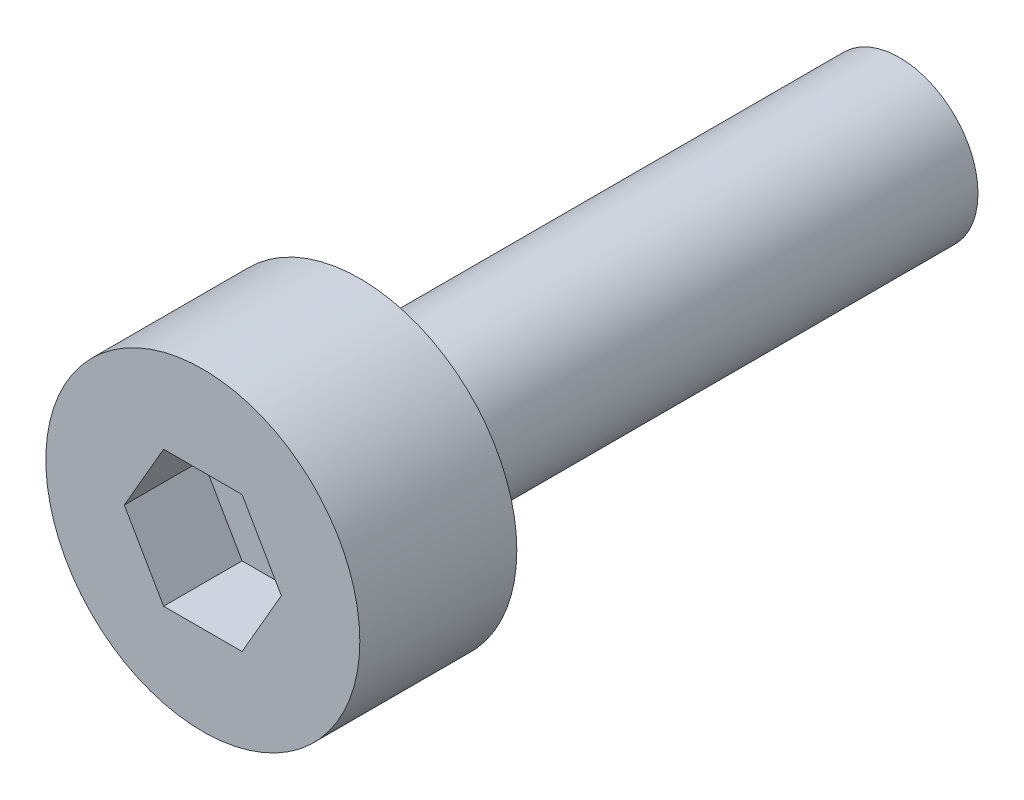
ISO-10303-21;
HEADER;
FILE_DESCRIPTION(('STEP AP214'),'2;1');
FILE_NAME('part.step','',(''),(''),'','','');
FILE_SCHEMA(('AUTOMOTIVE_DESIGN { 1 0 10303 214 1 1 1 1 }'));
ENDSEC;
DATA;
#1=APPLICATION_CONTEXT('core data for automotive mechanical design processes');
#2=APPLICATION_PROTOCOL_DEFINITION('international standard','automotive_design',2000,#1);
#3=PRODUCT_CONTEXT('',#1,'mechanical');
#4=PRODUCT('Part','Part','',(#3));
#5=PRODUCT_RELATED_PRODUCT_CATEGORY('part','',(#4));
#6=PRODUCT_DEFINITION_FORMATION('','',#4);
#7=PRODUCT_DEFINITION_CONTEXT('part definition',#1,'design');
#8=PRODUCT_DEFINITION('design','',#6,#7);
#9=PRODUCT_DEFINITION_SHAPE('','',#8);
#10=(LENGTH_UNIT() NAMED_UNIT(*) SI_UNIT(.MILLI.,.METRE.));
#11=(NAMED_UNIT(*) PLANE_ANGLE_UNIT() SI_UNIT($,.RADIAN.));
#12=(NAMED_UNIT(*) SI_UNIT($,.STERADIAN.) SOLID_ANGLE_UNIT());
#13=UNCERTAINTY_MEASURE_WITH_UNIT(LENGTH_MEASURE(1.E-05),#10,'distance_accuracy_value','');
#14=(GEOMETRIC_REPRESENTATION_CONTEXT(3) GLOBAL_UNCERTAINTY_ASSIGNED_CONTEXT((#13)) GLOBAL_UNIT_ASSIGNED_CONTEXT((#10,
#11,#12)) REPRESENTATION_CONTEXT('',''));
#15=CARTESIAN_POINT('',(0.,0.,0.));
#16=DIRECTION('',(0.,0.,1.));
#17=DIRECTION('',(1.,0.,0.));
#18=AXIS2_PLACEMENT_3D('',#15,#16,#17);
#19=CARTESIAN_POINT('',(0.,0.,1.6));
#20=DIRECTION('',(0.,0.,-1.));
#21=DIRECTION('',(-1.,0.,0.));
#22=AXIS2_PLACEMENT_3D('',#19,#20,#21);
#23=CYLINDRICAL_SURFACE('',#22,1.6);
#24=CARTESIAN_POINT('',(0.,0.,1.6));
#25=DIRECTION('',(0.,0.,1.));
#26=DIRECTION('',(1.,0.,0.));
#27=AXIS2_PLACEMENT_3D('',#24,#25,#26);
#28=CIRCLE('',#27,1.6);
#29=CARTESIAN_POINT('',(1.6,0.,1.6));
#30=VERTEX_POINT('',#29);
#31=EDGE_CURVE('E11',#30,#30,#28,.T.);
#32=ORIENTED_EDGE('',*,*,#31,.F.);
#33=EDGE_LOOP('',(#32));
#34=FACE_BOUND('',#33,.T.);
#35=CARTESIAN_POINT('',(0.,0.,0.));
#36=DIRECTION('',(0.,0.,1.));
#37=DIRECTION('',(1.,0.,0.));
#38=AXIS2_PLACEMENT_3D('',#35,#36,#37);
#39=CIRCLE('',#38,1.6);
#40=CARTESIAN_POINT('',(1.6,0.,0.));
#41=VERTEX_POINT('',#40);
#42=EDGE_CURVE('E35',#41,#41,#39,.T.);
#43=ORIENTED_EDGE('',*,*,#42,.T.);
#44=EDGE_LOOP('',(#43));
#45=FACE_BOUND('',#44,.T.);
#46=ADVANCED_FACE('F32',(#34,#45),#23,.T.);
#47=CARTESIAN_POINT('',(0.,0.,1.6));
#48=DIRECTION('',(0.,0.,1.));
#49=DIRECTION('',(1.,0.,0.));
#50=AXIS2_PLACEMENT_3D('',#47,#48,#49);
#51=PLANE('',#50);
#52=DIRECTION('',(0.5,0.866025403784439,0.));
#53=VECTOR('',#52,1.);
#54=CARTESIAN_POINT('',(0.4,-0.692820323027551,1.6));
#55=LINE('',#54,#53);
#56=CARTESIAN_POINT('',(0.4,-0.692820323027551,1.6));
#57=VERTEX_POINT('',#56);
#58=CARTESIAN_POINT('',(0.8,0.,1.6));
#59=VERTEX_POINT('',#58);
#60=EDGE_CURVE('E46',#57,#59,#55,.T.);
#61=ORIENTED_EDGE('',*,*,#60,.F.);
#62=DIRECTION('',(1.,0.,0.));
#63=VECTOR('',#62,1.);
#64=CARTESIAN_POINT('',(-0.4,-0.692820323027551,1.6));
#65=LINE('',#64,#63);
#66=CARTESIAN_POINT('',(-0.4,-0.692820323027551,1.6));
#67=VERTEX_POINT('',#66);
#68=EDGE_CURVE('E129',#67,#57,#65,.T.);
#69=ORIENTED_EDGE('',*,*,#68,.F.);
#70=DIRECTION('',(0.5,-0.866025403784438,0.));
#71=VECTOR('',#70,1.);
#72=CARTESIAN_POINT('',(-0.8,0.,1.6));
#73=LINE('',#72,#71);
#74=CARTESIAN_POINT('',(-0.8,0.,1.6));
#75=VERTEX_POINT('',#74);
#76=EDGE_CURVE('E127',#75,#67,#73,.T.);
#77=ORIENTED_EDGE('',*,*,#76,.F.);
#78=DIRECTION('',(-0.5,-0.866025403784439,0.));
#79=VECTOR('',#78,1.);
#80=CARTESIAN_POINT('',(-0.4,0.692820323027551,1.6));
#81=LINE('',#80,#79);
#82=CARTESIAN_POINT('',(-0.4,0.692820323027551,1.6));
#83=VERTEX_POINT('',#82);
#84=EDGE_CURVE('E94',#83,#75,#81,.T.);
#85=ORIENTED_EDGE('',*,*,#84,.F.);
#86=DIRECTION('',(-1.,0.,0.));
#87=VECTOR('',#86,1.);
#88=CARTESIAN_POINT('',(0.4,0.692820323027551,1.6));
#89=LINE('',#88,#87);
#90=CARTESIAN_POINT('',(0.4,0.692820323027551,1.6));
#91=VERTEX_POINT('',#90);
#92=EDGE_CURVE('E123',#91,#83,#89,.T.);
#93=ORIENTED_EDGE('',*,*,#92,.F.);
#94=DIRECTION('',(-0.5,0.866025403784438,0.));
#95=VECTOR('',#94,1.);
#96=CARTESIAN_POINT('',(0.8,0.,1.6));
#97=LINE('',#96,#95);
#98=EDGE_CURVE('E120',#59,#91,#97,.T.);
#99=ORIENTED_EDGE('',*,*,#98,.F.);
#100=EDGE_LOOP('',(#61,#69,#77,#85,#93,#99));
#101=FACE_BOUND('',#100,.T.);
#102=ORIENTED_EDGE('',*,*,#31,.T.);
#103=EDGE_LOOP('',(#102));
#104=FACE_BOUND('',#103,.T.);
#105=ADVANCED_FACE('F160',(#101,#104),#51,.T.);
#106=CARTESIAN_POINT('',(0.,0.,0.));
#107=DIRECTION('',(0.,0.,1.));
#108=DIRECTION('',(1.,0.,0.));
#109=AXIS2_PLACEMENT_3D('',#106,#107,#108);
#110=PLANE('',#109);
#111=CARTESIAN_POINT('',(0.,0.,0.));
#112=DIRECTION('',(0.,0.,1.));
#113=DIRECTION('',(1.,0.,0.));
#114=AXIS2_PLACEMENT_3D('',#111,#112,#113);
#115=CIRCLE('',#114,0.8);
#116=CARTESIAN_POINT('',(0.8,0.,0.));
#117=VERTEX_POINT('',#116);
#118=EDGE_CURVE('E133',#117,#117,#115,.T.);
#119=ORIENTED_EDGE('',*,*,#118,.T.);
#120=EDGE_LOOP('',(#119));
#121=FACE_BOUND('',#120,.T.);
#122=ORIENTED_EDGE('',*,*,#42,.F.);
#123=EDGE_LOOP('',(#122));
#124=FACE_BOUND('',#123,.T.);
#125=ADVANCED_FACE('F145',(#121,#124),#110,.F.);
#126=CARTESIAN_POINT('',(0.,0.,-5.5));
#127=DIRECTION('',(0.,0.,1.));
#128=DIRECTION('',(1.,0.,0.));
#129=AXIS2_PLACEMENT_3D('',#126,#127,#128);
#130=CYLINDRICAL_SURFACE('',#129,0.8);
#131=CARTESIAN_POINT('',(0.,0.,-5.5));
#132=DIRECTION('',(0.,0.,1.));
#133=DIRECTION('',(1.,0.,0.));
#134=AXIS2_PLACEMENT_3D('',#131,#132,#133);
#135=CIRCLE('',#134,0.8);
#136=CARTESIAN_POINT('',(0.8,0.,-5.5));
#137=VERTEX_POINT('',#136);
#138=EDGE_CURVE('E139',#137,#137,#135,.T.);
#139=ORIENTED_EDGE('',*,*,#138,.T.);
#140=EDGE_LOOP('',(#139));
#141=FACE_BOUND('',#140,.T.);
#142=ORIENTED_EDGE('',*,*,#118,.F.);
#143=EDGE_LOOP('',(#142));
#144=FACE_BOUND('',#143,.T.);
#145=ADVANCED_FACE('F148',(#141,#144),#130,.T.);
#146=CARTESIAN_POINT('',(0.,0.,-5.5));
#147=DIRECTION('',(0.,0.,1.));
#148=DIRECTION('',(1.,0.,0.));
#149=AXIS2_PLACEMENT_3D('',#146,#147,#148);
#150=PLANE('',#149);
#151=ORIENTED_EDGE('',*,*,#138,.F.);
#152=EDGE_LOOP('',(#151));
#153=FACE_BOUND('',#152,.T.);
#154=ADVANCED_FACE('F150',(#153),#150,.F.);
#155=CARTESIAN_POINT('',(0.4,-0.692820323027551,0.8));
#156=DIRECTION('',(0.866025403784439,-0.5,0.));
#157=DIRECTION('',(0.5,0.866025403784439,0.));
#158=AXIS2_PLACEMENT_3D('',#155,#156,#157);
#159=PLANE('',#158);
#160=ORIENTED_EDGE('',*,*,#60,.T.);
#161=DIRECTION('',(0.,0.,1.));
#162=VECTOR('',#161,1.);
#163=CARTESIAN_POINT('',(0.8,0.,0.8));
#164=LINE('',#163,#162);
#165=CARTESIAN_POINT('',(0.8,0.,0.8));
#166=VERTEX_POINT('',#165);
#167=EDGE_CURVE('E76',#166,#59,#164,.T.);
#168=ORIENTED_EDGE('',*,*,#167,.F.);
#169=DIRECTION('',(0.5,0.866025403784439,0.));
#170=VECTOR('',#169,1.);
#171=CARTESIAN_POINT('',(0.4,-0.692820323027551,0.8));
#172=LINE('',#171,#170);
#173=CARTESIAN_POINT('',(0.4,-0.692820323027551,0.8));
#174=VERTEX_POINT('',#173);
#175=EDGE_CURVE('E131',#174,#166,#172,.T.);
#176=ORIENTED_EDGE('',*,*,#175,.F.);
#177=DIRECTION('',(0.,0.,1.));
#178=VECTOR('',#177,1.);
#179=CARTESIAN_POINT('',(0.4,-0.692820323027551,0.8));
#180=LINE('',#179,#178);
#181=EDGE_CURVE('E54',#174,#57,#180,.T.);
#182=ORIENTED_EDGE('',*,*,#181,.T.);
#183=EDGE_LOOP('',(#160,#168,#176,#182));
#184=FACE_BOUND('',#183,.T.);
#185=ADVANCED_FACE('F157',(#184),#159,.F.);
#186=CARTESIAN_POINT('',(-0.4,-0.692820323027551,0.8));
#187=DIRECTION('',(0.,-1.,0.));
#188=DIRECTION('',(0.,0.,-1.));
#189=AXIS2_PLACEMENT_3D('',#186,#187,#188);
#190=PLANE('',#189);
#191=ORIENTED_EDGE('',*,*,#68,.T.);
#192=ORIENTED_EDGE('',*,*,#181,.F.);
#193=DIRECTION('',(1.,0.,0.));
#194=VECTOR('',#193,1.);
#195=CARTESIAN_POINT('',(-0.4,-0.692820323027551,0.8));
#196=LINE('',#195,#194);
#197=CARTESIAN_POINT('',(-0.4,-0.692820323027551,0.8));
#198=VERTEX_POINT('',#197);
#199=EDGE_CURVE('E106',#198,#174,#196,.T.);
#200=ORIENTED_EDGE('',*,*,#199,.F.);
#201=DIRECTION('',(0.,0.,1.));
#202=VECTOR('',#201,1.);
#203=CARTESIAN_POINT('',(-0.4,-0.692820323027551,0.8));
#204=LINE('',#203,#202);
#205=EDGE_CURVE('E98',#198,#67,#204,.T.);
#206=ORIENTED_EDGE('',*,*,#205,.T.);
#207=EDGE_LOOP('',(#191,#192,#200,#206));
#208=FACE_BOUND('',#207,.T.);
#209=ADVANCED_FACE('F182',(#208),#190,.F.);
#210=CARTESIAN_POINT('',(-0.8,0.,0.8));
#211=DIRECTION('',(-0.866025403784438,-0.5,0.));
#212=DIRECTION('',(0.5,-0.866025403784439,0.));
#213=AXIS2_PLACEMENT_3D('',#210,#211,#212);
#214=PLANE('',#213);
#215=ORIENTED_EDGE('',*,*,#76,.T.);
#216=ORIENTED_EDGE('',*,*,#205,.F.);
#217=DIRECTION('',(0.5,-0.866025403784438,0.));
#218=VECTOR('',#217,1.);
#219=CARTESIAN_POINT('',(-0.8,0.,0.8));
#220=LINE('',#219,#218);
#221=CARTESIAN_POINT('',(-0.8,0.,0.8));
#222=VERTEX_POINT('',#221);
#223=EDGE_CURVE('E102',#222,#198,#220,.T.);
#224=ORIENTED_EDGE('',*,*,#223,.F.);
#225=DIRECTION('',(0.,0.,1.));
#226=VECTOR('',#225,1.);
#227=CARTESIAN_POINT('',(-0.8,0.,0.8));
#228=LINE('',#227,#226);
#229=EDGE_CURVE('E87',#222,#75,#228,.T.);
#230=ORIENTED_EDGE('',*,*,#229,.T.);
#231=EDGE_LOOP('',(#215,#216,#224,#230));
#232=FACE_BOUND('',#231,.T.);
#233=ADVANCED_FACE('F103',(#232),#214,.F.);
#234=CARTESIAN_POINT('',(-0.4,0.692820323027551,0.8));
#235=DIRECTION('',(-0.866025403784439,0.5,0.));
#236=DIRECTION('',(-0.5,-0.866025403784439,0.));
#237=AXIS2_PLACEMENT_3D('',#234,#235,#236);
#238=PLANE('',#237);
#239=ORIENTED_EDGE('',*,*,#84,.T.);
#240=ORIENTED_EDGE('',*,*,#229,.F.);
#241=DIRECTION('',(-0.5,-0.866025403784439,0.));
#242=VECTOR('',#241,1.);
#243=CARTESIAN_POINT('',(-0.4,0.692820323027551,0.8));
#244=LINE('',#243,#242);
#245=CARTESIAN_POINT('',(-0.4,0.692820323027551,0.8));
#246=VERTEX_POINT('',#245);
#247=EDGE_CURVE('E91',#246,#222,#244,.T.);
#248=ORIENTED_EDGE('',*,*,#247,.F.);
#249=DIRECTION('',(0.,0.,1.));
#250=VECTOR('',#249,1.);
#251=CARTESIAN_POINT('',(-0.4,0.692820323027551,0.8));
#252=LINE('',#251,#250);
#253=EDGE_CURVE('E99',#246,#83,#252,.T.);
#254=ORIENTED_EDGE('',*,*,#253,.T.);
#255=EDGE_LOOP('',(#239,#240,#248,#254));
#256=FACE_BOUND('',#255,.T.);
#257=ADVANCED_FACE('F89',(#256),#238,.F.);
#258=CARTESIAN_POINT('',(0.4,0.692820323027551,0.8));
#259=DIRECTION('',(0.,1.,0.));
#260=DIRECTION('',(-1.,0.,0.));
#261=AXIS2_PLACEMENT_3D('',#258,#259,#260);
#262=PLANE('',#261);
#263=ORIENTED_EDGE('',*,*,#92,.T.);
#264=ORIENTED_EDGE('',*,*,#253,.F.);
#265=DIRECTION('',(-1.,0.,0.));
#266=VECTOR('',#265,1.);
#267=CARTESIAN_POINT('',(0.4,0.692820323027551,0.8));
#268=LINE('',#267,#266);
#269=CARTESIAN_POINT('',(0.4,0.692820323027551,0.8));
#270=VERTEX_POINT('',#269);
#271=EDGE_CURVE('E112',#270,#246,#268,.T.);
#272=ORIENTED_EDGE('',*,*,#271,.F.);
#273=DIRECTION('',(0.,0.,1.));
#274=VECTOR('',#273,1.);
#275=CARTESIAN_POINT('',(0.4,0.692820323027551,0.8));
#276=LINE('',#275,#274);
#277=EDGE_CURVE('E136',#270,#91,#276,.T.);
#278=ORIENTED_EDGE('',*,*,#277,.T.);
#279=EDGE_LOOP('',(#263,#264,#272,#278));
#280=FACE_BOUND('',#279,.T.);
#281=ADVANCED_FACE('F191',(#280),#262,.F.);
#282=CARTESIAN_POINT('',(0.8,0.,0.8));
#283=DIRECTION('',(0.866025403784438,0.5,0.));
#284=DIRECTION('',(-0.5,0.866025403784439,0.));
#285=AXIS2_PLACEMENT_3D('',#282,#283,#284);
#286=PLANE('',#285);
#287=ORIENTED_EDGE('',*,*,#98,.T.);
#288=ORIENTED_EDGE('',*,*,#277,.F.);
#289=DIRECTION('',(-0.5,0.866025403784438,0.));
#290=VECTOR('',#289,1.);
#291=CARTESIAN_POINT('',(0.8,0.,0.8));
#292=LINE('',#291,#290);
#293=EDGE_CURVE('E114',#166,#270,#292,.T.);
#294=ORIENTED_EDGE('',*,*,#293,.F.);
#295=ORIENTED_EDGE('',*,*,#167,.T.);
#296=EDGE_LOOP('',(#287,#288,#294,#295));
#297=FACE_BOUND('',#296,.T.);
#298=ADVANCED_FACE('F179',(#297),#286,.F.);
#299=CARTESIAN_POINT('',(0.,0.,0.8));
#300=DIRECTION('',(0.,0.,1.));
#301=DIRECTION('',(1.,0.,0.));
#302=AXIS2_PLACEMENT_3D('',#299,#300,#301);
#303=PLANE('',#302);
#304=ORIENTED_EDGE('',*,*,#175,.T.);
#305=ORIENTED_EDGE('',*,*,#293,.T.);
#306=ORIENTED_EDGE('',*,*,#271,.T.);
#307=ORIENTED_EDGE('',*,*,#247,.T.);
#308=ORIENTED_EDGE('',*,*,#223,.T.);
#309=ORIENTED_EDGE('',*,*,#199,.T.);
#310=EDGE_LOOP('',(#304,#305,#306,#307,#308,#309));
#311=FACE_BOUND('',#310,.T.);
#312=ADVANCED_FACE('F109',(#311),#303,.T.);
#313=CLOSED_SHELL('',(#46,#105,#125,#145,#154,#185,#209,#233,#257,#281,#298,#312));
#314=MANIFOLD_SOLID_BREP('B2',#313);
#315=ADVANCED_BREP_SHAPE_REPRESENTATION('',(#18,#314),#14);
#316=SHAPE_DEFINITION_REPRESENTATION(#9,#315);
ENDSEC;
END-ISO-10303-21;
